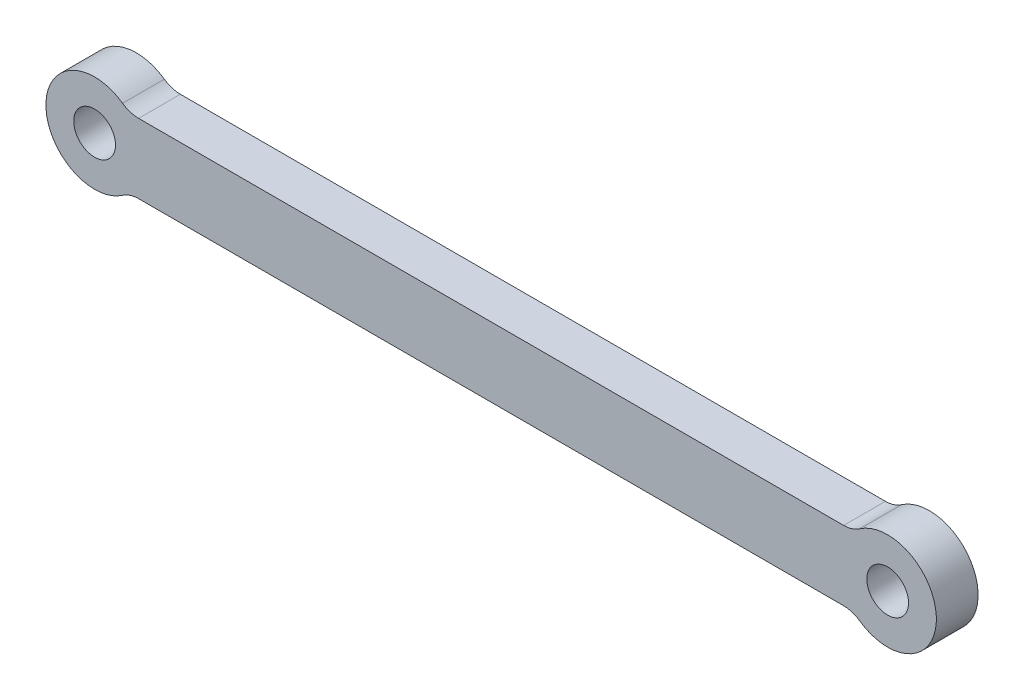
ISO-10303-21;
HEADER;
FILE_DESCRIPTION(('STEP AP214'),'2;1');
FILE_NAME('part.step','',(''),(''),'','','');
FILE_SCHEMA(('AUTOMOTIVE_DESIGN { 1 0 10303 214 1 1 1 1 }'));
ENDSEC;
DATA;
#1=APPLICATION_CONTEXT('core data for automotive mechanical design processes');
#2=APPLICATION_PROTOCOL_DEFINITION('international standard','automotive_design',2000,#1);
#3=PRODUCT_CONTEXT('',#1,'mechanical');
#4=PRODUCT('Part','Part','',(#3));
#5=PRODUCT_RELATED_PRODUCT_CATEGORY('part','',(#4));
#6=PRODUCT_DEFINITION_FORMATION('','',#4);
#7=PRODUCT_DEFINITION_CONTEXT('part definition',#1,'design');
#8=PRODUCT_DEFINITION('design','',#6,#7);
#9=PRODUCT_DEFINITION_SHAPE('','',#8);
#10=(LENGTH_UNIT() NAMED_UNIT(*) SI_UNIT(.MILLI.,.METRE.));
#11=(NAMED_UNIT(*) PLANE_ANGLE_UNIT() SI_UNIT($,.RADIAN.));
#12=(NAMED_UNIT(*) SI_UNIT($,.STERADIAN.) SOLID_ANGLE_UNIT());
#13=UNCERTAINTY_MEASURE_WITH_UNIT(LENGTH_MEASURE(1.E-05),#10,'distance_accuracy_value','');
#14=(GEOMETRIC_REPRESENTATION_CONTEXT(3) GLOBAL_UNCERTAINTY_ASSIGNED_CONTEXT((#13)) GLOBAL_UNIT_ASSIGNED_CONTEXT((#10,
#11,#12)) REPRESENTATION_CONTEXT('',''));
#15=CARTESIAN_POINT('',(0.,0.,0.));
#16=DIRECTION('',(0.,0.,1.));
#17=DIRECTION('',(1.,0.,0.));
#18=AXIS2_PLACEMENT_3D('',#15,#16,#17);
#19=CARTESIAN_POINT('',(53.8377223398316,-4.49999999999999,3.));
#20=DIRECTION('',(0.,0.,-1.));
#21=DIRECTION('',(-1.,0.,0.));
#22=AXIS2_PLACEMENT_3D('',#19,#20,#21);
#23=PLANE('',#22);
#24=CARTESIAN_POINT('',(53.8377223398316,-4.49999999999999,3.));
#25=DIRECTION('',(0.,0.,-1.));
#26=DIRECTION('',(-1.,0.,0.));
#27=AXIS2_PLACEMENT_3D('',#24,#25,#26);
#28=CIRCLE('',#27,2.);
#29=CARTESIAN_POINT('',(53.8377223398316,-2.49999999999999,3.));
#30=VERTEX_POINT('',#29);
#31=CARTESIAN_POINT('',(54.9876414889838,-2.86363636363636,3.));
#32=VERTEX_POINT('',#31);
#33=EDGE_CURVE('E146',#30,#32,#28,.T.);
#34=ORIENTED_EDGE('',*,*,#33,.T.);
#35=CARTESIAN_POINT('',(57.,0.,3.));
#36=DIRECTION('',(0.,0.,1.));
#37=DIRECTION('',(-1.,0.,0.));
#38=AXIS2_PLACEMENT_3D('',#35,#36,#37);
#39=CIRCLE('',#38,3.5);
#40=CARTESIAN_POINT('',(54.9876414889838,2.86363636363637,3.));
#41=VERTEX_POINT('',#40);
#42=EDGE_CURVE('E94',#32,#41,#39,.T.);
#43=ORIENTED_EDGE('',*,*,#42,.T.);
#44=CARTESIAN_POINT('',(53.8377223398316,4.49999999999999,3.));
#45=DIRECTION('',(0.,0.,-1.));
#46=DIRECTION('',(-1.,0.,0.));
#47=AXIS2_PLACEMENT_3D('',#44,#45,#46);
#48=CIRCLE('',#47,1.99999999999999);
#49=CARTESIAN_POINT('',(53.8377223398316,2.50000000000001,3.));
#50=VERTEX_POINT('',#49);
#51=EDGE_CURVE('E161',#41,#50,#48,.T.);
#52=ORIENTED_EDGE('',*,*,#51,.T.);
#53=DIRECTION('',(-1.,0.,0.));
#54=VECTOR('',#53,1.);
#55=CARTESIAN_POINT('',(3.16227766016838,2.5,3.));
#56=LINE('',#55,#54);
#57=CARTESIAN_POINT('',(3.16227766016838,2.5,3.));
#58=VERTEX_POINT('',#57);
#59=EDGE_CURVE('E174',#50,#58,#56,.T.);
#60=ORIENTED_EDGE('',*,*,#59,.T.);
#61=CARTESIAN_POINT('',(3.16227766016838,4.5,3.));
#62=DIRECTION('',(0.,0.,-1.));
#63=DIRECTION('',(-1.,0.,0.));
#64=AXIS2_PLACEMENT_3D('',#61,#62,#63);
#65=CIRCLE('',#64,2.);
#66=CARTESIAN_POINT('',(2.01235851101624,2.86363636363636,3.));
#67=VERTEX_POINT('',#66);
#68=EDGE_CURVE('E113',#58,#67,#65,.T.);
#69=ORIENTED_EDGE('',*,*,#68,.T.);
#70=CARTESIAN_POINT('',(0.,0.,3.));
#71=DIRECTION('',(0.,0.,1.));
#72=DIRECTION('',(1.,0.,0.));
#73=AXIS2_PLACEMENT_3D('',#70,#71,#72);
#74=CIRCLE('',#73,3.5);
#75=CARTESIAN_POINT('',(2.01235851101624,-2.86363636363636,3.));
#76=VERTEX_POINT('',#75);
#77=EDGE_CURVE('E107',#67,#76,#74,.T.);
#78=ORIENTED_EDGE('',*,*,#77,.T.);
#79=CARTESIAN_POINT('',(3.16227766016838,-4.5,3.));
#80=DIRECTION('',(0.,0.,-1.));
#81=DIRECTION('',(1.,0.,0.));
#82=AXIS2_PLACEMENT_3D('',#79,#80,#81);
#83=CIRCLE('',#82,2.);
#84=CARTESIAN_POINT('',(3.16227766016838,-2.5,3.));
#85=VERTEX_POINT('',#84);
#86=EDGE_CURVE('E111',#76,#85,#83,.T.);
#87=ORIENTED_EDGE('',*,*,#86,.T.);
#88=DIRECTION('',(1.,0.,0.));
#89=VECTOR('',#88,1.);
#90=CARTESIAN_POINT('',(3.16227766016838,-2.5,3.));
#91=LINE('',#90,#89);
#92=EDGE_CURVE('E51',#85,#30,#91,.T.);
#93=ORIENTED_EDGE('',*,*,#92,.T.);
#94=EDGE_LOOP('',(#34,#43,#52,#60,#69,#78,#87,#93));
#95=FACE_BOUND('',#94,.T.);
#96=CARTESIAN_POINT('',(0.,0.,3.));
#97=DIRECTION('',(0.,0.,1.));
#98=DIRECTION('',(1.,0.,0.));
#99=AXIS2_PLACEMENT_3D('',#96,#97,#98);
#100=CIRCLE('',#99,1.5);
#101=CARTESIAN_POINT('',(1.5,0.,3.));
#102=VERTEX_POINT('',#101);
#103=EDGE_CURVE('E135',#102,#102,#100,.T.);
#104=ORIENTED_EDGE('',*,*,#103,.F.);
#105=EDGE_LOOP('',(#104));
#106=FACE_BOUND('',#105,.T.);
#107=CARTESIAN_POINT('',(57.,0.,3.));
#108=DIRECTION('',(0.,0.,1.));
#109=DIRECTION('',(1.,0.,0.));
#110=AXIS2_PLACEMENT_3D('',#107,#108,#109);
#111=CIRCLE('',#110,1.5);
#112=CARTESIAN_POINT('',(58.5,0.,3.));
#113=VERTEX_POINT('',#112);
#114=EDGE_CURVE('E183',#113,#113,#111,.T.);
#115=ORIENTED_EDGE('',*,*,#114,.F.);
#116=EDGE_LOOP('',(#115));
#117=FACE_BOUND('',#116,.T.);
#118=ADVANCED_FACE('F34',(#95,#106,#117),#23,.F.);
#119=CARTESIAN_POINT('',(53.8377223398316,-4.49999999999999,0.));
#120=DIRECTION('',(0.,0.,-1.));
#121=DIRECTION('',(-1.,0.,0.));
#122=AXIS2_PLACEMENT_3D('',#119,#120,#121);
#123=PLANE('',#122);
#124=CARTESIAN_POINT('',(0.,0.,0.));
#125=DIRECTION('',(0.,0.,1.));
#126=DIRECTION('',(1.,0.,0.));
#127=AXIS2_PLACEMENT_3D('',#124,#125,#126);
#128=CIRCLE('',#127,1.5);
#129=CARTESIAN_POINT('',(1.5,0.,0.));
#130=VERTEX_POINT('',#129);
#131=EDGE_CURVE('E180',#130,#130,#128,.T.);
#132=ORIENTED_EDGE('',*,*,#131,.T.);
#133=EDGE_LOOP('',(#132));
#134=FACE_BOUND('',#133,.T.);
#135=CARTESIAN_POINT('',(53.8377223398316,-4.49999999999999,0.));
#136=DIRECTION('',(0.,0.,-1.));
#137=DIRECTION('',(-1.,0.,0.));
#138=AXIS2_PLACEMENT_3D('',#135,#136,#137);
#139=CIRCLE('',#138,2.);
#140=CARTESIAN_POINT('',(53.8377223398316,-2.49999999999999,0.));
#141=VERTEX_POINT('',#140);
#142=CARTESIAN_POINT('',(54.9876414889838,-2.86363636363636,0.));
#143=VERTEX_POINT('',#142);
#144=EDGE_CURVE('E131',#141,#143,#139,.T.);
#145=ORIENTED_EDGE('',*,*,#144,.F.);
#146=DIRECTION('',(1.,0.,0.));
#147=VECTOR('',#146,1.);
#148=CARTESIAN_POINT('',(3.16227766016838,-2.5,0.));
#149=LINE('',#148,#147);
#150=CARTESIAN_POINT('',(3.16227766016838,-2.5,0.));
#151=VERTEX_POINT('',#150);
#152=EDGE_CURVE('E86',#151,#141,#149,.T.);
#153=ORIENTED_EDGE('',*,*,#152,.F.);
#154=CARTESIAN_POINT('',(3.16227766016838,-4.5,0.));
#155=DIRECTION('',(0.,0.,-1.));
#156=DIRECTION('',(1.,0.,0.));
#157=AXIS2_PLACEMENT_3D('',#154,#155,#156);
#158=CIRCLE('',#157,2.);
#159=CARTESIAN_POINT('',(2.01235851101624,-2.86363636363636,0.));
#160=VERTEX_POINT('',#159);
#161=EDGE_CURVE('E80',#160,#151,#158,.T.);
#162=ORIENTED_EDGE('',*,*,#161,.F.);
#163=CARTESIAN_POINT('',(0.,0.,0.));
#164=DIRECTION('',(0.,0.,1.));
#165=DIRECTION('',(1.,0.,0.));
#166=AXIS2_PLACEMENT_3D('',#163,#164,#165);
#167=CIRCLE('',#166,3.5);
#168=CARTESIAN_POINT('',(2.01235851101624,2.86363636363636,0.));
#169=VERTEX_POINT('',#168);
#170=EDGE_CURVE('E121',#169,#160,#167,.T.);
#171=ORIENTED_EDGE('',*,*,#170,.F.);
#172=CARTESIAN_POINT('',(3.16227766016838,4.5,0.));
#173=DIRECTION('',(0.,0.,-1.));
#174=DIRECTION('',(-1.,0.,0.));
#175=AXIS2_PLACEMENT_3D('',#172,#173,#174);
#176=CIRCLE('',#175,2.);
#177=CARTESIAN_POINT('',(3.16227766016838,2.5,0.));
#178=VERTEX_POINT('',#177);
#179=EDGE_CURVE('E141',#178,#169,#176,.T.);
#180=ORIENTED_EDGE('',*,*,#179,.F.);
#181=DIRECTION('',(-1.,0.,0.));
#182=VECTOR('',#181,1.);
#183=CARTESIAN_POINT('',(3.16227766016838,2.5,0.));
#184=LINE('',#183,#182);
#185=CARTESIAN_POINT('',(53.8377223398316,2.50000000000001,0.));
#186=VERTEX_POINT('',#185);
#187=EDGE_CURVE('E139',#186,#178,#184,.T.);
#188=ORIENTED_EDGE('',*,*,#187,.F.);
#189=CARTESIAN_POINT('',(53.8377223398316,4.49999999999999,0.));
#190=DIRECTION('',(0.,0.,-1.));
#191=DIRECTION('',(-1.,0.,0.));
#192=AXIS2_PLACEMENT_3D('',#189,#190,#191);
#193=CIRCLE('',#192,1.99999999999999);
#194=CARTESIAN_POINT('',(54.9876414889838,2.86363636363637,0.));
#195=VERTEX_POINT('',#194);
#196=EDGE_CURVE('E137',#195,#186,#193,.T.);
#197=ORIENTED_EDGE('',*,*,#196,.F.);
#198=CARTESIAN_POINT('',(57.,0.,0.));
#199=DIRECTION('',(0.,0.,1.));
#200=DIRECTION('',(-1.,0.,0.));
#201=AXIS2_PLACEMENT_3D('',#198,#199,#200);
#202=CIRCLE('',#201,3.5);
#203=EDGE_CURVE('E134',#143,#195,#202,.T.);
#204=ORIENTED_EDGE('',*,*,#203,.F.);
#205=EDGE_LOOP('',(#145,#153,#162,#171,#180,#188,#197,#204));
#206=FACE_BOUND('',#205,.T.);
#207=CARTESIAN_POINT('',(57.,0.,0.));
#208=DIRECTION('',(0.,0.,1.));
#209=DIRECTION('',(1.,0.,0.));
#210=AXIS2_PLACEMENT_3D('',#207,#208,#209);
#211=CIRCLE('',#210,1.5);
#212=CARTESIAN_POINT('',(58.5,0.,0.));
#213=VERTEX_POINT('',#212);
#214=EDGE_CURVE('E186',#213,#213,#211,.T.);
#215=ORIENTED_EDGE('',*,*,#214,.T.);
#216=EDGE_LOOP('',(#215));
#217=FACE_BOUND('',#216,.T.);
#218=ADVANCED_FACE('F165',(#134,#206,#217),#123,.T.);
#219=CARTESIAN_POINT('',(53.8377223398316,-4.49999999999999,3.));
#220=DIRECTION('',(0.,0.,-1.));
#221=DIRECTION('',(-1.,0.,0.));
#222=AXIS2_PLACEMENT_3D('',#219,#220,#221);
#223=CYLINDRICAL_SURFACE('',#222,2.);
#224=ORIENTED_EDGE('',*,*,#144,.T.);
#225=DIRECTION('',(0.,0.,-1.));
#226=VECTOR('',#225,1.);
#227=CARTESIAN_POINT('',(54.9876414889838,-2.86363636363636,3.));
#228=LINE('',#227,#226);
#229=EDGE_CURVE('E11',#32,#143,#228,.T.);
#230=ORIENTED_EDGE('',*,*,#229,.F.);
#231=ORIENTED_EDGE('',*,*,#33,.F.);
#232=DIRECTION('',(0.,0.,-1.));
#233=VECTOR('',#232,1.);
#234=CARTESIAN_POINT('',(53.8377223398316,-2.49999999999999,3.));
#235=LINE('',#234,#233);
#236=EDGE_CURVE('E127',#30,#141,#235,.T.);
#237=ORIENTED_EDGE('',*,*,#236,.T.);
#238=EDGE_LOOP('',(#224,#230,#231,#237));
#239=FACE_BOUND('',#238,.T.);
#240=ADVANCED_FACE('F36',(#239),#223,.F.);
#241=CARTESIAN_POINT('',(57.,0.,3.));
#242=DIRECTION('',(0.,0.,-1.));
#243=DIRECTION('',(-1.,0.,0.));
#244=AXIS2_PLACEMENT_3D('',#241,#242,#243);
#245=CYLINDRICAL_SURFACE('',#244,3.5);
#246=ORIENTED_EDGE('',*,*,#203,.T.);
#247=DIRECTION('',(0.,0.,-1.));
#248=VECTOR('',#247,1.);
#249=CARTESIAN_POINT('',(54.9876414889838,2.86363636363637,3.));
#250=LINE('',#249,#248);
#251=EDGE_CURVE('E43',#41,#195,#250,.T.);
#252=ORIENTED_EDGE('',*,*,#251,.F.);
#253=ORIENTED_EDGE('',*,*,#42,.F.);
#254=ORIENTED_EDGE('',*,*,#229,.T.);
#255=EDGE_LOOP('',(#246,#252,#253,#254));
#256=FACE_BOUND('',#255,.T.);
#257=ADVANCED_FACE('F218',(#256),#245,.T.);
#258=CARTESIAN_POINT('',(53.8377223398316,4.49999999999999,3.));
#259=DIRECTION('',(0.,0.,-1.));
#260=DIRECTION('',(-1.,0.,0.));
#261=AXIS2_PLACEMENT_3D('',#258,#259,#260);
#262=CYLINDRICAL_SURFACE('',#261,1.99999999999999);
#263=ORIENTED_EDGE('',*,*,#196,.T.);
#264=DIRECTION('',(0.,0.,-1.));
#265=VECTOR('',#264,1.);
#266=CARTESIAN_POINT('',(53.8377223398316,2.50000000000001,3.));
#267=LINE('',#266,#265);
#268=EDGE_CURVE('E153',#50,#186,#267,.T.);
#269=ORIENTED_EDGE('',*,*,#268,.F.);
#270=ORIENTED_EDGE('',*,*,#51,.F.);
#271=ORIENTED_EDGE('',*,*,#251,.T.);
#272=EDGE_LOOP('',(#263,#269,#270,#271));
#273=FACE_BOUND('',#272,.T.);
#274=ADVANCED_FACE('F159',(#273),#262,.F.);
#275=CARTESIAN_POINT('',(3.16227766016838,2.5,3.));
#276=DIRECTION('',(0.,-1.,0.));
#277=DIRECTION('',(1.,0.,0.));
#278=AXIS2_PLACEMENT_3D('',#275,#276,#277);
#279=PLANE('',#278);
#280=ORIENTED_EDGE('',*,*,#187,.T.);
#281=DIRECTION('',(0.,0.,-1.));
#282=VECTOR('',#281,1.);
#283=CARTESIAN_POINT('',(3.16227766016838,2.5,3.));
#284=LINE('',#283,#282);
#285=EDGE_CURVE('E150',#58,#178,#284,.T.);
#286=ORIENTED_EDGE('',*,*,#285,.F.);
#287=ORIENTED_EDGE('',*,*,#59,.F.);
#288=ORIENTED_EDGE('',*,*,#268,.T.);
#289=EDGE_LOOP('',(#280,#286,#287,#288));
#290=FACE_BOUND('',#289,.T.);
#291=ADVANCED_FACE('F170',(#290),#279,.F.);
#292=CARTESIAN_POINT('',(3.16227766016838,4.5,3.));
#293=DIRECTION('',(0.,0.,-1.));
#294=DIRECTION('',(-1.,0.,0.));
#295=AXIS2_PLACEMENT_3D('',#292,#293,#294);
#296=CYLINDRICAL_SURFACE('',#295,2.);
#297=ORIENTED_EDGE('',*,*,#179,.T.);
#298=DIRECTION('',(0.,0.,-1.));
#299=VECTOR('',#298,1.);
#300=CARTESIAN_POINT('',(2.01235851101624,2.86363636363636,3.));
#301=LINE('',#300,#299);
#302=EDGE_CURVE('E122',#67,#169,#301,.T.);
#303=ORIENTED_EDGE('',*,*,#302,.F.);
#304=ORIENTED_EDGE('',*,*,#68,.F.);
#305=ORIENTED_EDGE('',*,*,#285,.T.);
#306=EDGE_LOOP('',(#297,#303,#304,#305));
#307=FACE_BOUND('',#306,.T.);
#308=ADVANCED_FACE('F173',(#307),#296,.F.);
#309=CARTESIAN_POINT('',(0.,0.,3.));
#310=DIRECTION('',(0.,0.,-1.));
#311=DIRECTION('',(-1.,0.,0.));
#312=AXIS2_PLACEMENT_3D('',#309,#310,#311);
#313=CYLINDRICAL_SURFACE('',#312,3.5);
#314=ORIENTED_EDGE('',*,*,#170,.T.);
#315=DIRECTION('',(0.,0.,-1.));
#316=VECTOR('',#315,1.);
#317=CARTESIAN_POINT('',(2.01235851101624,-2.86363636363636,3.));
#318=LINE('',#317,#316);
#319=EDGE_CURVE('E118',#76,#160,#318,.T.);
#320=ORIENTED_EDGE('',*,*,#319,.F.);
#321=ORIENTED_EDGE('',*,*,#77,.F.);
#322=ORIENTED_EDGE('',*,*,#302,.T.);
#323=EDGE_LOOP('',(#314,#320,#321,#322));
#324=FACE_BOUND('',#323,.T.);
#325=ADVANCED_FACE('F119',(#324),#313,.T.);
#326=CARTESIAN_POINT('',(3.16227766016838,-4.5,3.));
#327=DIRECTION('',(0.,0.,-1.));
#328=DIRECTION('',(-1.,0.,0.));
#329=AXIS2_PLACEMENT_3D('',#326,#327,#328);
#330=CYLINDRICAL_SURFACE('',#329,2.);
#331=ORIENTED_EDGE('',*,*,#161,.T.);
#332=DIRECTION('',(0.,0.,-1.));
#333=VECTOR('',#332,1.);
#334=CARTESIAN_POINT('',(3.16227766016838,-2.5,3.));
#335=LINE('',#334,#333);
#336=EDGE_CURVE('E123',#85,#151,#335,.T.);
#337=ORIENTED_EDGE('',*,*,#336,.F.);
#338=ORIENTED_EDGE('',*,*,#86,.F.);
#339=ORIENTED_EDGE('',*,*,#319,.T.);
#340=EDGE_LOOP('',(#331,#337,#338,#339));
#341=FACE_BOUND('',#340,.T.);
#342=ADVANCED_FACE('F125',(#341),#330,.F.);
#343=CARTESIAN_POINT('',(3.16227766016838,-2.5,3.));
#344=DIRECTION('',(0.,1.,0.));
#345=DIRECTION('',(-1.,0.,0.));
#346=AXIS2_PLACEMENT_3D('',#343,#344,#345);
#347=PLANE('',#346);
#348=ORIENTED_EDGE('',*,*,#152,.T.);
#349=ORIENTED_EDGE('',*,*,#236,.F.);
#350=ORIENTED_EDGE('',*,*,#92,.F.);
#351=ORIENTED_EDGE('',*,*,#336,.T.);
#352=EDGE_LOOP('',(#348,#349,#350,#351));
#353=FACE_BOUND('',#352,.T.);
#354=ADVANCED_FACE('F206',(#353),#347,.F.);
#355=CARTESIAN_POINT('',(0.,0.,3.));
#356=DIRECTION('',(0.,0.,-1.));
#357=DIRECTION('',(-1.,0.,0.));
#358=AXIS2_PLACEMENT_3D('',#355,#356,#357);
#359=CYLINDRICAL_SURFACE('',#358,1.5);
#360=ORIENTED_EDGE('',*,*,#103,.T.);
#361=EDGE_LOOP('',(#360));
#362=FACE_BOUND('',#361,.T.);
#363=ORIENTED_EDGE('',*,*,#131,.F.);
#364=EDGE_LOOP('',(#363));
#365=FACE_BOUND('',#364,.T.);
#366=ADVANCED_FACE('F203',(#362,#365),#359,.F.);
#367=CARTESIAN_POINT('',(57.,0.,3.));
#368=DIRECTION('',(0.,0.,-1.));
#369=DIRECTION('',(-1.,0.,0.));
#370=AXIS2_PLACEMENT_3D('',#367,#368,#369);
#371=CYLINDRICAL_SURFACE('',#370,1.5);
#372=ORIENTED_EDGE('',*,*,#114,.T.);
#373=EDGE_LOOP('',(#372));
#374=FACE_BOUND('',#373,.T.);
#375=ORIENTED_EDGE('',*,*,#214,.F.);
#376=EDGE_LOOP('',(#375));
#377=FACE_BOUND('',#376,.T.);
#378=ADVANCED_FACE('F192',(#374,#377),#371,.F.);
#379=CLOSED_SHELL('',(#118,#218,#240,#257,#274,#291,#308,#325,#342,#354,#366,#378));
#380=MANIFOLD_SOLID_BREP('B2',#379);
#381=ADVANCED_BREP_SHAPE_REPRESENTATION('',(#18,#380),#14);
#382=SHAPE_DEFINITION_REPRESENTATION(#9,#381);
ENDSEC;
END-ISO-10303-21;
